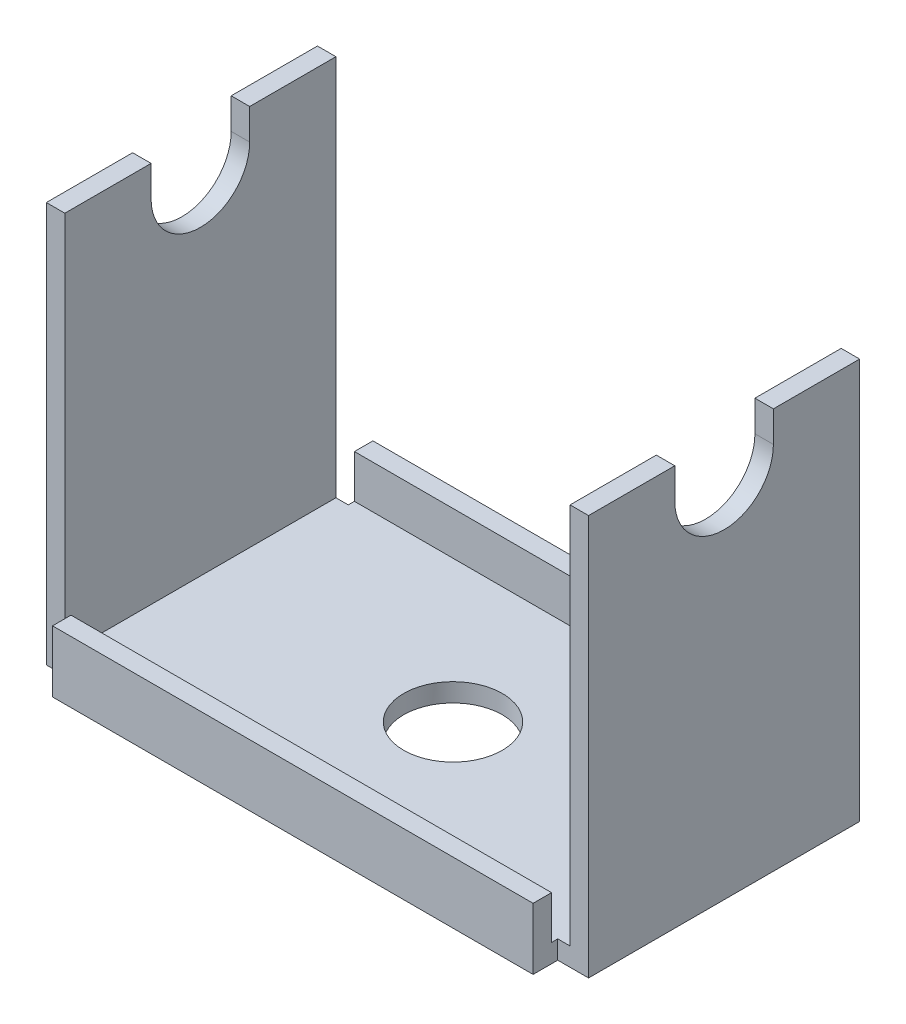
ISO-10303-21;
HEADER;
FILE_DESCRIPTION(('STEP AP214'),'2;1');
FILE_NAME('part.step','',(''),(''),'','','');
FILE_SCHEMA(('AUTOMOTIVE_DESIGN { 1 0 10303 214 1 1 1 1 }'));
ENDSEC;
DATA;
#1=APPLICATION_CONTEXT('core data for automotive mechanical design processes');
#2=APPLICATION_PROTOCOL_DEFINITION('international standard','automotive_design',2000,#1);
#3=PRODUCT_CONTEXT('',#1,'mechanical');
#4=PRODUCT('Part','Part','',(#3));
#5=PRODUCT_RELATED_PRODUCT_CATEGORY('part','',(#4));
#6=PRODUCT_DEFINITION_FORMATION('','',#4);
#7=PRODUCT_DEFINITION_CONTEXT('part definition',#1,'design');
#8=PRODUCT_DEFINITION('design','',#6,#7);
#9=PRODUCT_DEFINITION_SHAPE('','',#8);
#10=(LENGTH_UNIT() NAMED_UNIT(*) SI_UNIT(.MILLI.,.METRE.));
#11=(NAMED_UNIT(*) PLANE_ANGLE_UNIT() SI_UNIT($,.RADIAN.));
#12=(NAMED_UNIT(*) SI_UNIT($,.STERADIAN.) SOLID_ANGLE_UNIT());
#13=UNCERTAINTY_MEASURE_WITH_UNIT(LENGTH_MEASURE(1.E-05),#10,'distance_accuracy_value','');
#14=(GEOMETRIC_REPRESENTATION_CONTEXT(3) GLOBAL_UNCERTAINTY_ASSIGNED_CONTEXT((#13)) GLOBAL_UNIT_ASSIGNED_CONTEXT((#10,
#11,#12)) REPRESENTATION_CONTEXT('',''));
#15=CARTESIAN_POINT('',(0.,0.,0.));
#16=DIRECTION('',(0.,0.,1.));
#17=DIRECTION('',(1.,0.,0.));
#18=AXIS2_PLACEMENT_3D('',#15,#16,#17);
#19=CARTESIAN_POINT('',(-20.5,32.5,-11.));
#20=DIRECTION('',(0.,1.,0.));
#21=DIRECTION('',(0.,0.,1.));
#22=AXIS2_PLACEMENT_3D('',#19,#20,#21);
#23=PLANE('',#22);
#24=DIRECTION('',(1.,0.,0.));
#25=VECTOR('',#24,1.);
#26=CARTESIAN_POINT('',(-22.000025,32.5,4.));
#27=LINE('',#26,#25);
#28=CARTESIAN_POINT('',(-22.,32.5,4.));
#29=VERTEX_POINT('',#28);
#30=CARTESIAN_POINT('',(-20.5,32.5,4.));
#31=VERTEX_POINT('',#30);
#32=EDGE_CURVE('E512',#29,#31,#27,.T.);
#33=ORIENTED_EDGE('',*,*,#32,.F.);
#34=DIRECTION('',(0.,0.,1.));
#35=VECTOR('',#34,1.);
#36=CARTESIAN_POINT('',(-22.,32.5,-11.));
#37=LINE('',#36,#35);
#38=CARTESIAN_POINT('',(-22.,32.5,11.));
#39=VERTEX_POINT('',#38);
#40=EDGE_CURVE('E252',#29,#39,#37,.T.);
#41=ORIENTED_EDGE('',*,*,#40,.T.);
#42=DIRECTION('',(-1.,0.,0.));
#43=VECTOR('',#42,1.);
#44=CARTESIAN_POINT('',(-20.5,32.5,11.));
#45=LINE('',#44,#43);
#46=CARTESIAN_POINT('',(-20.5,32.5,11.));
#47=VERTEX_POINT('',#46);
#48=EDGE_CURVE('E266',#47,#39,#45,.T.);
#49=ORIENTED_EDGE('',*,*,#48,.F.);
#50=DIRECTION('',(0.,0.,1.));
#51=VECTOR('',#50,1.);
#52=CARTESIAN_POINT('',(-20.5,32.5,-11.));
#53=LINE('',#52,#51);
#54=EDGE_CURVE('E304',#31,#47,#53,.T.);
#55=ORIENTED_EDGE('',*,*,#54,.F.);
#56=EDGE_LOOP('',(#33,#41,#49,#55));
#57=FACE_BOUND('',#56,.T.);
#58=ADVANCED_FACE('F32',(#57),#23,.T.);
#59=CARTESIAN_POINT('',(22.,32.5,-11.));
#60=DIRECTION('',(0.,1.,0.));
#61=DIRECTION('',(0.,0.,1.));
#62=AXIS2_PLACEMENT_3D('',#59,#60,#61);
#63=PLANE('',#62);
#64=CARTESIAN_POINT('',(20.5,32.5,4.));
#65=VERTEX_POINT('',#64);
#66=CARTESIAN_POINT('',(22.,32.5,4.));
#67=VERTEX_POINT('',#66);
#68=EDGE_CURVE('E345',#65,#67,#27,.T.);
#69=ORIENTED_EDGE('',*,*,#68,.F.);
#70=DIRECTION('',(0.,0.,1.));
#71=VECTOR('',#70,1.);
#72=CARTESIAN_POINT('',(20.5,32.5,-11.));
#73=LINE('',#72,#71);
#74=CARTESIAN_POINT('',(20.5,32.5,11.));
#75=VERTEX_POINT('',#74);
#76=EDGE_CURVE('E296',#65,#75,#73,.T.);
#77=ORIENTED_EDGE('',*,*,#76,.T.);
#78=DIRECTION('',(-1.,0.,0.));
#79=VECTOR('',#78,1.);
#80=CARTESIAN_POINT('',(22.,32.5,11.));
#81=LINE('',#80,#79);
#82=CARTESIAN_POINT('',(22.,32.5,11.));
#83=VERTEX_POINT('',#82);
#84=EDGE_CURVE('E326',#83,#75,#81,.T.);
#85=ORIENTED_EDGE('',*,*,#84,.F.);
#86=DIRECTION('',(0.,0.,1.));
#87=VECTOR('',#86,1.);
#88=CARTESIAN_POINT('',(22.,32.5,-11.));
#89=LINE('',#88,#87);
#90=EDGE_CURVE('E292',#67,#83,#89,.T.);
#91=ORIENTED_EDGE('',*,*,#90,.F.);
#92=EDGE_LOOP('',(#69,#77,#85,#91));
#93=FACE_BOUND('',#92,.T.);
#94=ADVANCED_FACE('F343',(#93),#63,.T.);
#95=CARTESIAN_POINT('',(-22.,32.5,-11.));
#96=DIRECTION('',(0.,0.,1.));
#97=DIRECTION('',(1.,0.,0.));
#98=AXIS2_PLACEMENT_3D('',#95,#96,#97);
#99=PLANE('',#98);
#100=DIRECTION('',(0.,1.,0.));
#101=VECTOR('',#100,1.);
#102=CARTESIAN_POINT('',(-19.5,1.5,-11.));
#103=LINE('',#102,#101);
#104=CARTESIAN_POINT('',(-19.5,0.,-11.));
#105=VERTEX_POINT('',#104);
#106=CARTESIAN_POINT('',(-19.5,1.5,-11.));
#107=VERTEX_POINT('',#106);
#108=EDGE_CURVE('E439',#105,#107,#103,.T.);
#109=ORIENTED_EDGE('',*,*,#108,.F.);
#110=DIRECTION('',(1.,0.,0.));
#111=VECTOR('',#110,1.);
#112=CARTESIAN_POINT('',(-22.,0.,-11.));
#113=LINE('',#112,#111);
#114=CARTESIAN_POINT('',(-22.,0.,-11.));
#115=VERTEX_POINT('',#114);
#116=EDGE_CURVE('E420',#115,#105,#113,.T.);
#117=ORIENTED_EDGE('',*,*,#116,.F.);
#118=DIRECTION('',(0.,-1.,0.));
#119=VECTOR('',#118,1.);
#120=CARTESIAN_POINT('',(-22.,32.5,-11.));
#121=LINE('',#120,#119);
#122=CARTESIAN_POINT('',(-22.,32.5,-11.));
#123=VERTEX_POINT('',#122);
#124=EDGE_CURVE('E412',#123,#115,#121,.T.);
#125=ORIENTED_EDGE('',*,*,#124,.F.);
#126=DIRECTION('',(-1.,0.,0.));
#127=VECTOR('',#126,1.);
#128=CARTESIAN_POINT('',(-20.5,32.5,-11.));
#129=LINE('',#128,#127);
#130=CARTESIAN_POINT('',(-20.5,32.5,-11.));
#131=VERTEX_POINT('',#130);
#132=EDGE_CURVE('E312',#131,#123,#129,.T.);
#133=ORIENTED_EDGE('',*,*,#132,.F.);
#134=DIRECTION('',(0.,1.,0.));
#135=VECTOR('',#134,1.);
#136=CARTESIAN_POINT('',(-20.5,1.5,-11.));
#137=LINE('',#136,#135);
#138=CARTESIAN_POINT('',(-20.5,1.5,-11.));
#139=VERTEX_POINT('',#138);
#140=EDGE_CURVE('E248',#139,#131,#137,.T.);
#141=ORIENTED_EDGE('',*,*,#140,.F.);
#142=DIRECTION('',(-1.,0.,0.));
#143=VECTOR('',#142,1.);
#144=CARTESIAN_POINT('',(20.5,1.5,-11.));
#145=LINE('',#144,#143);
#146=EDGE_CURVE('E249',#107,#139,#145,.T.);
#147=ORIENTED_EDGE('',*,*,#146,.F.);
#148=EDGE_LOOP('',(#109,#117,#125,#133,#141,#147));
#149=FACE_BOUND('',#148,.T.);
#150=ADVANCED_FACE('F481',(#149),#99,.F.);
#151=CARTESIAN_POINT('',(-22.,32.5,11.));
#152=DIRECTION('',(0.,0.,1.));
#153=DIRECTION('',(1.,0.,0.));
#154=AXIS2_PLACEMENT_3D('',#151,#152,#153);
#155=PLANE('',#154);
#156=DIRECTION('',(1.,0.,0.));
#157=VECTOR('',#156,1.);
#158=CARTESIAN_POINT('',(-22.,0.,11.));
#159=LINE('',#158,#157);
#160=CARTESIAN_POINT('',(-22.,0.,11.));
#161=VERTEX_POINT('',#160);
#162=CARTESIAN_POINT('',(-19.5,0.,11.));
#163=VERTEX_POINT('',#162);
#164=EDGE_CURVE('E282',#161,#163,#159,.T.);
#165=ORIENTED_EDGE('',*,*,#164,.T.);
#166=DIRECTION('',(0.,1.,0.));
#167=VECTOR('',#166,1.);
#168=CARTESIAN_POINT('',(-19.5,1.5,11.));
#169=LINE('',#168,#167);
#170=CARTESIAN_POINT('',(-19.5,1.5,11.));
#171=VERTEX_POINT('',#170);
#172=EDGE_CURVE('E386',#163,#171,#169,.T.);
#173=ORIENTED_EDGE('',*,*,#172,.T.);
#174=DIRECTION('',(-1.,0.,0.));
#175=VECTOR('',#174,1.);
#176=CARTESIAN_POINT('',(20.5,1.5,11.));
#177=LINE('',#176,#175);
#178=CARTESIAN_POINT('',(-20.5,1.5,11.));
#179=VERTEX_POINT('',#178);
#180=EDGE_CURVE('E319',#171,#179,#177,.T.);
#181=ORIENTED_EDGE('',*,*,#180,.T.);
#182=DIRECTION('',(0.,1.,0.));
#183=VECTOR('',#182,1.);
#184=CARTESIAN_POINT('',(-20.5,1.5,11.));
#185=LINE('',#184,#183);
#186=EDGE_CURVE('E309',#179,#47,#185,.T.);
#187=ORIENTED_EDGE('',*,*,#186,.T.);
#188=ORIENTED_EDGE('',*,*,#48,.T.);
#189=DIRECTION('',(0.,-1.,0.));
#190=VECTOR('',#189,1.);
#191=CARTESIAN_POINT('',(-22.,32.5,11.));
#192=LINE('',#191,#190);
#193=EDGE_CURVE('E269',#39,#161,#192,.T.);
#194=ORIENTED_EDGE('',*,*,#193,.T.);
#195=EDGE_LOOP('',(#165,#173,#181,#187,#188,#194));
#196=FACE_BOUND('',#195,.T.);
#197=ADVANCED_FACE('F499',(#196),#155,.T.);
#198=DIRECTION('',(1.,0.,0.));
#199=VECTOR('',#198,1.);
#200=CARTESIAN_POINT('',(-22.000025,32.5,-4.));
#201=LINE('',#200,#199);
#202=CARTESIAN_POINT('',(-22.,32.5,-4.));
#203=VERTEX_POINT('',#202);
#204=CARTESIAN_POINT('',(-20.5,32.5,-4.));
#205=VERTEX_POINT('',#204);
#206=EDGE_CURVE('E508',#203,#205,#201,.T.);
#207=ORIENTED_EDGE('',*,*,#206,.T.);
#208=EDGE_CURVE('E305',#131,#205,#53,.T.);
#209=ORIENTED_EDGE('',*,*,#208,.F.);
#210=ORIENTED_EDGE('',*,*,#132,.T.);
#211=EDGE_CURVE('E284',#123,#203,#37,.T.);
#212=ORIENTED_EDGE('',*,*,#211,.T.);
#213=EDGE_LOOP('',(#207,#209,#210,#212));
#214=FACE_BOUND('',#213,.T.);
#215=ADVANCED_FACE('F34',(#214),#23,.T.);
#216=CARTESIAN_POINT('',(-20.5,1.5,-11.));
#217=DIRECTION('',(1.,0.,0.));
#218=DIRECTION('',(0.,0.,-1.));
#219=AXIS2_PLACEMENT_3D('',#216,#217,#218);
#220=PLANE('',#219);
#221=DIRECTION('',(0.,-1.,0.));
#222=VECTOR('',#221,1.);
#223=CARTESIAN_POINT('',(-20.5,1.5,4.));
#224=LINE('',#223,#222);
#225=CARTESIAN_POINT('',(-20.5,30.,4.));
#226=VERTEX_POINT('',#225);
#227=EDGE_CURVE('E526',#31,#226,#224,.T.);
#228=ORIENTED_EDGE('',*,*,#227,.F.);
#229=ORIENTED_EDGE('',*,*,#54,.T.);
#230=ORIENTED_EDGE('',*,*,#186,.F.);
#231=DIRECTION('',(0.,0.,1.));
#232=VECTOR('',#231,1.);
#233=CARTESIAN_POINT('',(-20.5,1.5,-11.));
#234=LINE('',#233,#232);
#235=EDGE_CURVE('E301',#139,#179,#234,.T.);
#236=ORIENTED_EDGE('',*,*,#235,.F.);
#237=ORIENTED_EDGE('',*,*,#140,.T.);
#238=ORIENTED_EDGE('',*,*,#208,.T.);
#239=DIRECTION('',(0.,1.,0.));
#240=VECTOR('',#239,1.);
#241=CARTESIAN_POINT('',(-20.5,1.5,-4.));
#242=LINE('',#241,#240);
#243=CARTESIAN_POINT('',(-20.5,30.,-4.));
#244=VERTEX_POINT('',#243);
#245=EDGE_CURVE('E521',#244,#205,#242,.T.);
#246=ORIENTED_EDGE('',*,*,#245,.F.);
#247=CARTESIAN_POINT('',(-20.5,30.,0.));
#248=DIRECTION('',(1.,0.,0.));
#249=DIRECTION('',(0.,0.,-1.));
#250=AXIS2_PLACEMENT_3D('',#247,#248,#249);
#251=CIRCLE('',#250,4.);
#252=EDGE_CURVE('E530',#226,#244,#251,.T.);
#253=ORIENTED_EDGE('',*,*,#252,.F.);
#254=EDGE_LOOP('',(#228,#229,#230,#236,#237,#238,#246,#253));
#255=FACE_BOUND('',#254,.T.);
#256=ADVANCED_FACE('F486',(#255),#220,.T.);
#257=CARTESIAN_POINT('',(20.5,1.5,-11.));
#258=DIRECTION('',(0.,1.,0.));
#259=DIRECTION('',(0.,0.,1.));
#260=AXIS2_PLACEMENT_3D('',#257,#258,#259);
#261=PLANE('',#260);
#262=CARTESIAN_POINT('',(0.,1.5,0.));
#263=DIRECTION('',(0.,1.,0.));
#264=DIRECTION('',(0.,0.,1.));
#265=AXIS2_PLACEMENT_3D('',#262,#263,#264);
#266=CIRCLE('',#265,4.);
#267=CARTESIAN_POINT('',(0.,1.5,4.));
#268=VERTEX_POINT('',#267);
#269=EDGE_CURVE('E532',#268,#268,#266,.T.);
#270=ORIENTED_EDGE('',*,*,#269,.F.);
#271=EDGE_LOOP('',(#270));
#272=FACE_BOUND('',#271,.T.);
#273=CARTESIAN_POINT('',(20.5,1.5,11.));
#274=VERTEX_POINT('',#273);
#275=CARTESIAN_POINT('',(19.5,1.5,11.));
#276=VERTEX_POINT('',#275);
#277=EDGE_CURVE('E313',#274,#276,#177,.T.);
#278=ORIENTED_EDGE('',*,*,#277,.F.);
#279=DIRECTION('',(0.,0.,1.));
#280=VECTOR('',#279,1.);
#281=CARTESIAN_POINT('',(20.5,1.5,-11.));
#282=LINE('',#281,#280);
#283=CARTESIAN_POINT('',(20.5,1.5,-11.));
#284=VERTEX_POINT('',#283);
#285=EDGE_CURVE('E247',#284,#274,#282,.T.);
#286=ORIENTED_EDGE('',*,*,#285,.F.);
#287=CARTESIAN_POINT('',(19.5,1.5,-11.));
#288=VERTEX_POINT('',#287);
#289=EDGE_CURVE('E238',#284,#288,#145,.T.);
#290=ORIENTED_EDGE('',*,*,#289,.T.);
#291=DIRECTION('',(0.,0.,-1.));
#292=VECTOR('',#291,1.);
#293=CARTESIAN_POINT('',(19.5,1.5,-11.5));
#294=LINE('',#293,#292);
#295=CARTESIAN_POINT('',(19.5,1.5,-11.5));
#296=VERTEX_POINT('',#295);
#297=EDGE_CURVE('E220',#288,#296,#294,.T.);
#298=ORIENTED_EDGE('',*,*,#297,.T.);
#299=DIRECTION('',(-1.,0.,0.));
#300=VECTOR('',#299,1.);
#301=CARTESIAN_POINT('',(19.5,1.5,-11.5));
#302=LINE('',#301,#300);
#303=CARTESIAN_POINT('',(-19.5,1.5,-11.5));
#304=VERTEX_POINT('',#303);
#305=EDGE_CURVE('E231',#296,#304,#302,.T.);
#306=ORIENTED_EDGE('',*,*,#305,.T.);
#307=DIRECTION('',(0.,0.,-1.));
#308=VECTOR('',#307,1.);
#309=CARTESIAN_POINT('',(-19.5,1.5,-11.5));
#310=LINE('',#309,#308);
#311=EDGE_CURVE('E243',#107,#304,#310,.T.);
#312=ORIENTED_EDGE('',*,*,#311,.F.);
#313=ORIENTED_EDGE('',*,*,#146,.T.);
#314=ORIENTED_EDGE('',*,*,#235,.T.);
#315=ORIENTED_EDGE('',*,*,#180,.F.);
#316=DIRECTION('',(0.,0.,1.));
#317=VECTOR('',#316,1.);
#318=CARTESIAN_POINT('',(-19.5,1.5,11.5));
#319=LINE('',#318,#317);
#320=CARTESIAN_POINT('',(-19.5,1.5,11.5));
#321=VERTEX_POINT('',#320);
#322=EDGE_CURVE('E388',#171,#321,#319,.T.);
#323=ORIENTED_EDGE('',*,*,#322,.T.);
#324=DIRECTION('',(-1.,0.,0.));
#325=VECTOR('',#324,1.);
#326=CARTESIAN_POINT('',(19.5,1.5,11.5));
#327=LINE('',#326,#325);
#328=CARTESIAN_POINT('',(19.5,1.5,11.5));
#329=VERTEX_POINT('',#328);
#330=EDGE_CURVE('E270',#329,#321,#327,.T.);
#331=ORIENTED_EDGE('',*,*,#330,.F.);
#332=DIRECTION('',(0.,0.,1.));
#333=VECTOR('',#332,1.);
#334=CARTESIAN_POINT('',(19.5,1.5,11.5));
#335=LINE('',#334,#333);
#336=EDGE_CURVE('E350',#276,#329,#335,.T.);
#337=ORIENTED_EDGE('',*,*,#336,.F.);
#338=EDGE_LOOP('',(#278,#286,#290,#298,#306,#312,#313,#314,#315,#323,#331,#337));
#339=FACE_BOUND('',#338,.T.);
#340=ADVANCED_FACE('F246',(#272,#339),#261,.T.);
#341=CARTESIAN_POINT('',(20.5,32.5,-11.));
#342=DIRECTION('',(-1.,0.,0.));
#343=DIRECTION('',(0.,0.,1.));
#344=AXIS2_PLACEMENT_3D('',#341,#342,#343);
#345=PLANE('',#344);
#346=DIRECTION('',(0.,1.,0.));
#347=VECTOR('',#346,1.);
#348=CARTESIAN_POINT('',(20.5,32.5,4.));
#349=LINE('',#348,#347);
#350=CARTESIAN_POINT('',(20.5,30.,4.));
#351=VERTEX_POINT('',#350);
#352=EDGE_CURVE('E524',#351,#65,#349,.T.);
#353=ORIENTED_EDGE('',*,*,#352,.F.);
#354=CARTESIAN_POINT('',(20.5,30.,0.));
#355=DIRECTION('',(-1.,0.,0.));
#356=DIRECTION('',(0.,0.,1.));
#357=AXIS2_PLACEMENT_3D('',#354,#355,#356);
#358=CIRCLE('',#357,4.);
#359=CARTESIAN_POINT('',(20.5,30.,-4.));
#360=VERTEX_POINT('',#359);
#361=EDGE_CURVE('E528',#360,#351,#358,.T.);
#362=ORIENTED_EDGE('',*,*,#361,.F.);
#363=DIRECTION('',(0.,-1.,0.));
#364=VECTOR('',#363,1.);
#365=CARTESIAN_POINT('',(20.5,32.5,-4.));
#366=LINE('',#365,#364);
#367=CARTESIAN_POINT('',(20.5,32.5,-4.));
#368=VERTEX_POINT('',#367);
#369=EDGE_CURVE('E519',#368,#360,#366,.T.);
#370=ORIENTED_EDGE('',*,*,#369,.F.);
#371=CARTESIAN_POINT('',(20.5,32.5,-11.));
#372=VERTEX_POINT('',#371);
#373=EDGE_CURVE('E297',#372,#368,#73,.T.);
#374=ORIENTED_EDGE('',*,*,#373,.F.);
#375=DIRECTION('',(0.,-1.,0.));
#376=VECTOR('',#375,1.);
#377=CARTESIAN_POINT('',(20.5,32.5,-11.));
#378=LINE('',#377,#376);
#379=EDGE_CURVE('E254',#372,#284,#378,.T.);
#380=ORIENTED_EDGE('',*,*,#379,.T.);
#381=ORIENTED_EDGE('',*,*,#285,.T.);
#382=DIRECTION('',(0.,-1.,0.));
#383=VECTOR('',#382,1.);
#384=CARTESIAN_POINT('',(20.5,32.5,11.));
#385=LINE('',#384,#383);
#386=EDGE_CURVE('E316',#75,#274,#385,.T.);
#387=ORIENTED_EDGE('',*,*,#386,.F.);
#388=ORIENTED_EDGE('',*,*,#76,.F.);
#389=EDGE_LOOP('',(#353,#362,#370,#374,#380,#381,#387,#388));
#390=FACE_BOUND('',#389,.T.);
#391=ADVANCED_FACE('F348',(#390),#345,.T.);
#392=CARTESIAN_POINT('',(22.,32.5,-4.));
#393=VERTEX_POINT('',#392);
#394=EDGE_CURVE('E510',#368,#393,#201,.T.);
#395=ORIENTED_EDGE('',*,*,#394,.T.);
#396=CARTESIAN_POINT('',(22.,32.5,-11.));
#397=VERTEX_POINT('',#396);
#398=EDGE_CURVE('E293',#397,#393,#89,.T.);
#399=ORIENTED_EDGE('',*,*,#398,.F.);
#400=DIRECTION('',(-1.,0.,0.));
#401=VECTOR('',#400,1.);
#402=CARTESIAN_POINT('',(22.,32.5,-11.));
#403=LINE('',#402,#401);
#404=EDGE_CURVE('E425',#397,#372,#403,.T.);
#405=ORIENTED_EDGE('',*,*,#404,.T.);
#406=ORIENTED_EDGE('',*,*,#373,.T.);
#407=EDGE_LOOP('',(#395,#399,#405,#406));
#408=FACE_BOUND('',#407,.T.);
#409=ADVANCED_FACE('F563',(#408),#63,.T.);
#410=CARTESIAN_POINT('',(22.,0.,-11.));
#411=DIRECTION('',(1.,0.,0.));
#412=DIRECTION('',(0.,1.,0.));
#413=AXIS2_PLACEMENT_3D('',#410,#411,#412);
#414=PLANE('',#413);
#415=DIRECTION('',(0.,-1.,0.));
#416=VECTOR('',#415,1.);
#417=CARTESIAN_POINT('',(22.,30.,4.));
#418=LINE('',#417,#416);
#419=CARTESIAN_POINT('',(22.,30.,4.));
#420=VERTEX_POINT('',#419);
#421=EDGE_CURVE('E340',#67,#420,#418,.T.);
#422=ORIENTED_EDGE('',*,*,#421,.F.);
#423=ORIENTED_EDGE('',*,*,#90,.T.);
#424=DIRECTION('',(0.,1.,0.));
#425=VECTOR('',#424,1.);
#426=CARTESIAN_POINT('',(22.,0.,11.));
#427=LINE('',#426,#425);
#428=CARTESIAN_POINT('',(22.,0.,11.));
#429=VERTEX_POINT('',#428);
#430=EDGE_CURVE('E276',#429,#83,#427,.T.);
#431=ORIENTED_EDGE('',*,*,#430,.F.);
#432=DIRECTION('',(0.,0.,1.));
#433=VECTOR('',#432,1.);
#434=CARTESIAN_POINT('',(22.,0.,-11.));
#435=LINE('',#434,#433);
#436=CARTESIAN_POINT('',(22.,0.,-11.));
#437=VERTEX_POINT('',#436);
#438=EDGE_CURVE('E289',#437,#429,#435,.T.);
#439=ORIENTED_EDGE('',*,*,#438,.F.);
#440=DIRECTION('',(0.,1.,0.));
#441=VECTOR('',#440,1.);
#442=CARTESIAN_POINT('',(22.,0.,-11.));
#443=LINE('',#442,#441);
#444=EDGE_CURVE('E417',#437,#397,#443,.T.);
#445=ORIENTED_EDGE('',*,*,#444,.T.);
#446=ORIENTED_EDGE('',*,*,#398,.T.);
#447=DIRECTION('',(0.,1.,0.));
#448=VECTOR('',#447,1.);
#449=CARTESIAN_POINT('',(22.,32.5,-4.));
#450=LINE('',#449,#448);
#451=CARTESIAN_POINT('',(22.,30.,-4.));
#452=VERTEX_POINT('',#451);
#453=EDGE_CURVE('E555',#452,#393,#450,.T.);
#454=ORIENTED_EDGE('',*,*,#453,.F.);
#455=CARTESIAN_POINT('',(22.,30.,0.));
#456=DIRECTION('',(1.,0.,0.));
#457=DIRECTION('',(0.,1.,0.));
#458=AXIS2_PLACEMENT_3D('',#455,#456,#457);
#459=CIRCLE('',#458,4.);
#460=EDGE_CURVE('E49',#420,#452,#459,.T.);
#461=ORIENTED_EDGE('',*,*,#460,.F.);
#462=EDGE_LOOP('',(#422,#423,#431,#439,#445,#446,#454,#461));
#463=FACE_BOUND('',#462,.T.);
#464=ADVANCED_FACE('F337',(#463),#414,.T.);
#465=CARTESIAN_POINT('',(-22.,0.,-11.));
#466=DIRECTION('',(0.,-1.,0.));
#467=DIRECTION('',(0.,0.,-1.));
#468=AXIS2_PLACEMENT_3D('',#465,#466,#467);
#469=PLANE('',#468);
#470=CARTESIAN_POINT('',(0.,0.,0.));
#471=DIRECTION('',(0.,-1.,0.));
#472=DIRECTION('',(0.,0.,-1.));
#473=AXIS2_PLACEMENT_3D('',#470,#471,#472);
#474=CIRCLE('',#473,4.);
#475=CARTESIAN_POINT('',(0.,0.,-4.));
#476=VERTEX_POINT('',#475);
#477=EDGE_CURVE('E443',#476,#476,#474,.T.);
#478=ORIENTED_EDGE('',*,*,#477,.F.);
#479=EDGE_LOOP('',(#478));
#480=FACE_BOUND('',#479,.T.);
#481=ORIENTED_EDGE('',*,*,#164,.F.);
#482=DIRECTION('',(0.,0.,1.));
#483=VECTOR('',#482,1.);
#484=CARTESIAN_POINT('',(-22.,0.,-11.));
#485=LINE('',#484,#483);
#486=EDGE_CURVE('E287',#115,#161,#485,.T.);
#487=ORIENTED_EDGE('',*,*,#486,.F.);
#488=ORIENTED_EDGE('',*,*,#116,.T.);
#489=DIRECTION('',(0.,0.,1.));
#490=VECTOR('',#489,1.);
#491=CARTESIAN_POINT('',(-19.5,0.,-11.));
#492=LINE('',#491,#490);
#493=CARTESIAN_POINT('',(-19.5,0.,-13.));
#494=VERTEX_POINT('',#493);
#495=EDGE_CURVE('E442',#494,#105,#492,.T.);
#496=ORIENTED_EDGE('',*,*,#495,.F.);
#497=DIRECTION('',(-1.,0.,0.));
#498=VECTOR('',#497,1.);
#499=CARTESIAN_POINT('',(19.5,0.,-13.));
#500=LINE('',#499,#498);
#501=CARTESIAN_POINT('',(19.5,0.,-13.));
#502=VERTEX_POINT('',#501);
#503=EDGE_CURVE('E374',#502,#494,#500,.T.);
#504=ORIENTED_EDGE('',*,*,#503,.F.);
#505=DIRECTION('',(0.,0.,1.));
#506=VECTOR('',#505,1.);
#507=CARTESIAN_POINT('',(19.5,0.,-11.));
#508=LINE('',#507,#506);
#509=CARTESIAN_POINT('',(19.5,0.,-11.));
#510=VERTEX_POINT('',#509);
#511=EDGE_CURVE('E242',#502,#510,#508,.T.);
#512=ORIENTED_EDGE('',*,*,#511,.T.);
#513=EDGE_CURVE('E241',#510,#437,#113,.T.);
#514=ORIENTED_EDGE('',*,*,#513,.T.);
#515=ORIENTED_EDGE('',*,*,#438,.T.);
#516=CARTESIAN_POINT('',(19.5,0.,11.));
#517=VERTEX_POINT('',#516);
#518=EDGE_CURVE('E273',#517,#429,#159,.T.);
#519=ORIENTED_EDGE('',*,*,#518,.F.);
#520=DIRECTION('',(0.,0.,-1.));
#521=VECTOR('',#520,1.);
#522=CARTESIAN_POINT('',(19.5,0.,11.));
#523=LINE('',#522,#521);
#524=CARTESIAN_POINT('',(19.5,0.,13.));
#525=VERTEX_POINT('',#524);
#526=EDGE_CURVE('E360',#525,#517,#523,.T.);
#527=ORIENTED_EDGE('',*,*,#526,.F.);
#528=DIRECTION('',(-1.,0.,0.));
#529=VECTOR('',#528,1.);
#530=CARTESIAN_POINT('',(19.5,0.,13.));
#531=LINE('',#530,#529);
#532=CARTESIAN_POINT('',(-19.5,0.,13.));
#533=VERTEX_POINT('',#532);
#534=EDGE_CURVE('E402',#525,#533,#531,.T.);
#535=ORIENTED_EDGE('',*,*,#534,.T.);
#536=DIRECTION('',(0.,0.,-1.));
#537=VECTOR('',#536,1.);
#538=CARTESIAN_POINT('',(-19.5,0.,11.));
#539=LINE('',#538,#537);
#540=EDGE_CURVE('E361',#533,#163,#539,.T.);
#541=ORIENTED_EDGE('',*,*,#540,.T.);
#542=EDGE_LOOP('',(#481,#487,#488,#496,#504,#512,#514,#515,#519,#527,#535,#541));
#543=FACE_BOUND('',#542,.T.);
#544=ADVANCED_FACE('F427',(#480,#543),#469,.T.);
#545=CARTESIAN_POINT('',(-22.,32.5,-11.));
#546=DIRECTION('',(-1.,0.,0.));
#547=DIRECTION('',(0.,-1.,0.));
#548=AXIS2_PLACEMENT_3D('',#545,#546,#547);
#549=PLANE('',#548);
#550=DIRECTION('',(0.,1.,0.));
#551=VECTOR('',#550,1.);
#552=CARTESIAN_POINT('',(-22.,32.5,4.));
#553=LINE('',#552,#551);
#554=CARTESIAN_POINT('',(-22.,30.,4.));
#555=VERTEX_POINT('',#554);
#556=EDGE_CURVE('E11',#555,#29,#553,.T.);
#557=ORIENTED_EDGE('',*,*,#556,.F.);
#558=CARTESIAN_POINT('',(-22.,30.,0.));
#559=DIRECTION('',(1.,0.,0.));
#560=DIRECTION('',(0.,1.,0.));
#561=AXIS2_PLACEMENT_3D('',#558,#559,#560);
#562=CIRCLE('',#561,4.);
#563=CARTESIAN_POINT('',(-22.,30.,-4.));
#564=VERTEX_POINT('',#563);
#565=EDGE_CURVE('E36',#564,#555,#562,.F.);
#566=ORIENTED_EDGE('',*,*,#565,.F.);
#567=DIRECTION('',(0.,-1.,0.));
#568=VECTOR('',#567,1.);
#569=CARTESIAN_POINT('',(-22.,32.5,-4.));
#570=LINE('',#569,#568);
#571=EDGE_CURVE('E308',#203,#564,#570,.T.);
#572=ORIENTED_EDGE('',*,*,#571,.F.);
#573=ORIENTED_EDGE('',*,*,#211,.F.);
#574=ORIENTED_EDGE('',*,*,#124,.T.);
#575=ORIENTED_EDGE('',*,*,#486,.T.);
#576=ORIENTED_EDGE('',*,*,#193,.F.);
#577=ORIENTED_EDGE('',*,*,#40,.F.);
#578=EDGE_LOOP('',(#557,#566,#572,#573,#574,#575,#576,#577));
#579=FACE_BOUND('',#578,.T.);
#580=ADVANCED_FACE('F504',(#579),#549,.T.);
#581=ORIENTED_EDGE('',*,*,#513,.F.);
#582=DIRECTION('',(0.,1.,0.));
#583=VECTOR('',#582,1.);
#584=CARTESIAN_POINT('',(19.5,1.5,-11.));
#585=LINE('',#584,#583);
#586=EDGE_CURVE('E224',#510,#288,#585,.T.);
#587=ORIENTED_EDGE('',*,*,#586,.T.);
#588=ORIENTED_EDGE('',*,*,#289,.F.);
#589=ORIENTED_EDGE('',*,*,#379,.F.);
#590=ORIENTED_EDGE('',*,*,#404,.F.);
#591=ORIENTED_EDGE('',*,*,#444,.F.);
#592=EDGE_LOOP('',(#581,#587,#588,#589,#590,#591));
#593=FACE_BOUND('',#592,.T.);
#594=ADVANCED_FACE('F236',(#593),#99,.F.);
#595=DIRECTION('',(0.,1.,0.));
#596=VECTOR('',#595,1.);
#597=CARTESIAN_POINT('',(19.5,1.5,11.));
#598=LINE('',#597,#596);
#599=EDGE_CURVE('E356',#517,#276,#598,.T.);
#600=ORIENTED_EDGE('',*,*,#599,.F.);
#601=ORIENTED_EDGE('',*,*,#518,.T.);
#602=ORIENTED_EDGE('',*,*,#430,.T.);
#603=ORIENTED_EDGE('',*,*,#84,.T.);
#604=ORIENTED_EDGE('',*,*,#386,.T.);
#605=ORIENTED_EDGE('',*,*,#277,.T.);
#606=EDGE_LOOP('',(#600,#601,#602,#603,#604,#605));
#607=FACE_BOUND('',#606,.T.);
#608=ADVANCED_FACE('F332',(#607),#155,.T.);
#609=CARTESIAN_POINT('',(19.5,5.,11.5));
#610=DIRECTION('',(0.,0.,1.));
#611=DIRECTION('',(1.,0.,0.));
#612=AXIS2_PLACEMENT_3D('',#609,#610,#611);
#613=PLANE('',#612);
#614=DIRECTION('',(0.,1.,0.));
#615=VECTOR('',#614,1.);
#616=CARTESIAN_POINT('',(-19.5,5.,11.5));
#617=LINE('',#616,#615);
#618=CARTESIAN_POINT('',(-19.5,5.,11.5));
#619=VERTEX_POINT('',#618);
#620=EDGE_CURVE('E383',#321,#619,#617,.T.);
#621=ORIENTED_EDGE('',*,*,#620,.T.);
#622=DIRECTION('',(-1.,0.,0.));
#623=VECTOR('',#622,1.);
#624=CARTESIAN_POINT('',(19.5,5.,11.5));
#625=LINE('',#624,#623);
#626=CARTESIAN_POINT('',(19.5,5.,11.5));
#627=VERTEX_POINT('',#626);
#628=EDGE_CURVE('E407',#627,#619,#625,.T.);
#629=ORIENTED_EDGE('',*,*,#628,.F.);
#630=DIRECTION('',(0.,1.,0.));
#631=VECTOR('',#630,1.);
#632=CARTESIAN_POINT('',(19.5,5.,11.5));
#633=LINE('',#632,#631);
#634=EDGE_CURVE('E355',#329,#627,#633,.T.);
#635=ORIENTED_EDGE('',*,*,#634,.F.);
#636=ORIENTED_EDGE('',*,*,#330,.T.);
#637=EDGE_LOOP('',(#621,#629,#635,#636));
#638=FACE_BOUND('',#637,.T.);
#639=ADVANCED_FACE('F597',(#638),#613,.F.);
#640=CARTESIAN_POINT('',(19.5,5.,13.));
#641=DIRECTION('',(0.,-1.,0.));
#642=DIRECTION('',(0.,0.,-1.));
#643=AXIS2_PLACEMENT_3D('',#640,#641,#642);
#644=PLANE('',#643);
#645=DIRECTION('',(0.,0.,1.));
#646=VECTOR('',#645,1.);
#647=CARTESIAN_POINT('',(-19.5,5.,13.));
#648=LINE('',#647,#646);
#649=CARTESIAN_POINT('',(-19.5,5.,13.));
#650=VERTEX_POINT('',#649);
#651=EDGE_CURVE('E391',#619,#650,#648,.T.);
#652=ORIENTED_EDGE('',*,*,#651,.T.);
#653=DIRECTION('',(-1.,0.,0.));
#654=VECTOR('',#653,1.);
#655=CARTESIAN_POINT('',(19.5,5.,13.));
#656=LINE('',#655,#654);
#657=CARTESIAN_POINT('',(19.5,5.,13.));
#658=VERTEX_POINT('',#657);
#659=EDGE_CURVE('E405',#658,#650,#656,.T.);
#660=ORIENTED_EDGE('',*,*,#659,.F.);
#661=DIRECTION('',(0.,0.,1.));
#662=VECTOR('',#661,1.);
#663=CARTESIAN_POINT('',(19.5,5.,13.));
#664=LINE('',#663,#662);
#665=EDGE_CURVE('E377',#627,#658,#664,.T.);
#666=ORIENTED_EDGE('',*,*,#665,.F.);
#667=ORIENTED_EDGE('',*,*,#628,.T.);
#668=EDGE_LOOP('',(#652,#660,#666,#667));
#669=FACE_BOUND('',#668,.T.);
#670=ADVANCED_FACE('F602',(#669),#644,.F.);
#671=CARTESIAN_POINT('',(19.5,0.,13.));
#672=DIRECTION('',(0.,0.,-1.));
#673=DIRECTION('',(-1.,0.,0.));
#674=AXIS2_PLACEMENT_3D('',#671,#672,#673);
#675=PLANE('',#674);
#676=DIRECTION('',(0.,-1.,0.));
#677=VECTOR('',#676,1.);
#678=CARTESIAN_POINT('',(-19.5,0.,13.));
#679=LINE('',#678,#677);
#680=EDGE_CURVE('E364',#650,#533,#679,.T.);
#681=ORIENTED_EDGE('',*,*,#680,.T.);
#682=ORIENTED_EDGE('',*,*,#534,.F.);
#683=DIRECTION('',(0.,-1.,0.));
#684=VECTOR('',#683,1.);
#685=CARTESIAN_POINT('',(19.5,0.,13.));
#686=LINE('',#685,#684);
#687=EDGE_CURVE('E379',#658,#525,#686,.T.);
#688=ORIENTED_EDGE('',*,*,#687,.F.);
#689=ORIENTED_EDGE('',*,*,#659,.T.);
#690=EDGE_LOOP('',(#681,#682,#688,#689));
#691=FACE_BOUND('',#690,.T.);
#692=ADVANCED_FACE('F496',(#691),#675,.F.);
#693=CARTESIAN_POINT('',(19.5,0.,11.));
#694=DIRECTION('',(-1.,0.,0.));
#695=DIRECTION('',(0.,0.,1.));
#696=AXIS2_PLACEMENT_3D('',#693,#694,#695);
#697=PLANE('',#696);
#698=ORIENTED_EDGE('',*,*,#599,.T.);
#699=ORIENTED_EDGE('',*,*,#336,.T.);
#700=ORIENTED_EDGE('',*,*,#634,.T.);
#701=ORIENTED_EDGE('',*,*,#665,.T.);
#702=ORIENTED_EDGE('',*,*,#687,.T.);
#703=ORIENTED_EDGE('',*,*,#526,.T.);
#704=EDGE_LOOP('',(#698,#699,#700,#701,#702,#703));
#705=FACE_BOUND('',#704,.T.);
#706=ADVANCED_FACE('F358',(#705),#697,.F.);
#707=CARTESIAN_POINT('',(-19.5,0.,11.));
#708=DIRECTION('',(-1.,0.,0.));
#709=DIRECTION('',(0.,0.,1.));
#710=AXIS2_PLACEMENT_3D('',#707,#708,#709);
#711=PLANE('',#710);
#712=ORIENTED_EDGE('',*,*,#172,.F.);
#713=ORIENTED_EDGE('',*,*,#540,.F.);
#714=ORIENTED_EDGE('',*,*,#680,.F.);
#715=ORIENTED_EDGE('',*,*,#651,.F.);
#716=ORIENTED_EDGE('',*,*,#620,.F.);
#717=ORIENTED_EDGE('',*,*,#322,.F.);
#718=EDGE_LOOP('',(#712,#713,#714,#715,#716,#717));
#719=FACE_BOUND('',#718,.T.);
#720=ADVANCED_FACE('F491',(#719),#711,.T.);
#721=CARTESIAN_POINT('',(19.5,0.,-13.));
#722=DIRECTION('',(0.,0.,-1.));
#723=DIRECTION('',(-1.,0.,0.));
#724=AXIS2_PLACEMENT_3D('',#721,#722,#723);
#725=PLANE('',#724);
#726=DIRECTION('',(0.,-1.,0.));
#727=VECTOR('',#726,1.);
#728=CARTESIAN_POINT('',(-19.5,0.,-13.));
#729=LINE('',#728,#727);
#730=CARTESIAN_POINT('',(-19.5,5.,-13.));
#731=VERTEX_POINT('',#730);
#732=EDGE_CURVE('E449',#731,#494,#729,.T.);
#733=ORIENTED_EDGE('',*,*,#732,.F.);
#734=DIRECTION('',(-1.,0.,0.));
#735=VECTOR('',#734,1.);
#736=CARTESIAN_POINT('',(19.5,5.,-13.));
#737=LINE('',#736,#735);
#738=CARTESIAN_POINT('',(19.5,5.,-13.));
#739=VERTEX_POINT('',#738);
#740=EDGE_CURVE('E460',#739,#731,#737,.T.);
#741=ORIENTED_EDGE('',*,*,#740,.F.);
#742=DIRECTION('',(0.,-1.,0.));
#743=VECTOR('',#742,1.);
#744=CARTESIAN_POINT('',(19.5,0.,-13.));
#745=LINE('',#744,#743);
#746=EDGE_CURVE('E430',#739,#502,#745,.T.);
#747=ORIENTED_EDGE('',*,*,#746,.T.);
#748=ORIENTED_EDGE('',*,*,#503,.T.);
#749=EDGE_LOOP('',(#733,#741,#747,#748));
#750=FACE_BOUND('',#749,.T.);
#751=ADVANCED_FACE('F466',(#750),#725,.T.);
#752=CARTESIAN_POINT('',(19.5,5.,-13.));
#753=DIRECTION('',(0.,1.,0.));
#754=DIRECTION('',(0.,0.,1.));
#755=AXIS2_PLACEMENT_3D('',#752,#753,#754);
#756=PLANE('',#755);
#757=DIRECTION('',(0.,0.,-1.));
#758=VECTOR('',#757,1.);
#759=CARTESIAN_POINT('',(-19.5,5.,-13.));
#760=LINE('',#759,#758);
#761=CARTESIAN_POINT('',(-19.5,5.,-11.5));
#762=VERTEX_POINT('',#761);
#763=EDGE_CURVE('E452',#762,#731,#760,.T.);
#764=ORIENTED_EDGE('',*,*,#763,.F.);
#765=DIRECTION('',(-1.,0.,0.));
#766=VECTOR('',#765,1.);
#767=CARTESIAN_POINT('',(19.5,5.,-11.5));
#768=LINE('',#767,#766);
#769=CARTESIAN_POINT('',(19.5,5.,-11.5));
#770=VERTEX_POINT('',#769);
#771=EDGE_CURVE('E459',#770,#762,#768,.T.);
#772=ORIENTED_EDGE('',*,*,#771,.F.);
#773=DIRECTION('',(0.,0.,-1.));
#774=VECTOR('',#773,1.);
#775=CARTESIAN_POINT('',(19.5,5.,-13.));
#776=LINE('',#775,#774);
#777=EDGE_CURVE('E432',#770,#739,#776,.T.);
#778=ORIENTED_EDGE('',*,*,#777,.T.);
#779=ORIENTED_EDGE('',*,*,#740,.T.);
#780=EDGE_LOOP('',(#764,#772,#778,#779));
#781=FACE_BOUND('',#780,.T.);
#782=ADVANCED_FACE('F472',(#781),#756,.T.);
#783=CARTESIAN_POINT('',(19.5,5.,-11.5));
#784=DIRECTION('',(0.,0.,1.));
#785=DIRECTION('',(1.,0.,0.));
#786=AXIS2_PLACEMENT_3D('',#783,#784,#785);
#787=PLANE('',#786);
#788=DIRECTION('',(0.,1.,0.));
#789=VECTOR('',#788,1.);
#790=CARTESIAN_POINT('',(-19.5,5.,-11.5));
#791=LINE('',#790,#789);
#792=EDGE_CURVE('E455',#304,#762,#791,.T.);
#793=ORIENTED_EDGE('',*,*,#792,.F.);
#794=ORIENTED_EDGE('',*,*,#305,.F.);
#795=DIRECTION('',(0.,1.,0.));
#796=VECTOR('',#795,1.);
#797=CARTESIAN_POINT('',(19.5,5.,-11.5));
#798=LINE('',#797,#796);
#799=EDGE_CURVE('E228',#296,#770,#798,.T.);
#800=ORIENTED_EDGE('',*,*,#799,.T.);
#801=ORIENTED_EDGE('',*,*,#771,.T.);
#802=EDGE_LOOP('',(#793,#794,#800,#801));
#803=FACE_BOUND('',#802,.T.);
#804=ADVANCED_FACE('F474',(#803),#787,.T.);
#805=CARTESIAN_POINT('',(19.5,0.,-11.));
#806=DIRECTION('',(-1.,0.,0.));
#807=DIRECTION('',(0.,0.,-1.));
#808=AXIS2_PLACEMENT_3D('',#805,#806,#807);
#809=PLANE('',#808);
#810=ORIENTED_EDGE('',*,*,#586,.F.);
#811=ORIENTED_EDGE('',*,*,#511,.F.);
#812=ORIENTED_EDGE('',*,*,#746,.F.);
#813=ORIENTED_EDGE('',*,*,#777,.F.);
#814=ORIENTED_EDGE('',*,*,#799,.F.);
#815=ORIENTED_EDGE('',*,*,#297,.F.);
#816=EDGE_LOOP('',(#810,#811,#812,#813,#814,#815));
#817=FACE_BOUND('',#816,.T.);
#818=ADVANCED_FACE('F222',(#817),#809,.F.);
#819=CARTESIAN_POINT('',(-19.5,0.,-11.));
#820=DIRECTION('',(-1.,0.,0.));
#821=DIRECTION('',(0.,0.,-1.));
#822=AXIS2_PLACEMENT_3D('',#819,#820,#821);
#823=PLANE('',#822);
#824=ORIENTED_EDGE('',*,*,#108,.T.);
#825=ORIENTED_EDGE('',*,*,#311,.T.);
#826=ORIENTED_EDGE('',*,*,#792,.T.);
#827=ORIENTED_EDGE('',*,*,#763,.T.);
#828=ORIENTED_EDGE('',*,*,#732,.T.);
#829=ORIENTED_EDGE('',*,*,#495,.T.);
#830=EDGE_LOOP('',(#824,#825,#826,#827,#828,#829));
#831=FACE_BOUND('',#830,.T.);
#832=ADVANCED_FACE('F469',(#831),#823,.T.);
#833=CARTESIAN_POINT('',(0.,-4.99999999999199E-05,0.));
#834=DIRECTION('',(0.,1.,0.));
#835=DIRECTION('',(0.,0.,1.));
#836=AXIS2_PLACEMENT_3D('',#833,#834,#835);
#837=CYLINDRICAL_SURFACE('',#836,4.);
#838=ORIENTED_EDGE('',*,*,#477,.T.);
#839=EDGE_LOOP('',(#838));
#840=FACE_BOUND('',#839,.T.);
#841=ORIENTED_EDGE('',*,*,#269,.T.);
#842=EDGE_LOOP('',(#841));
#843=FACE_BOUND('',#842,.T.);
#844=ADVANCED_FACE('F624',(#840,#843),#837,.F.);
#845=CARTESIAN_POINT('',(-22.000025,32.5,-4.));
#846=DIRECTION('',(0.,0.,-1.));
#847=DIRECTION('',(-1.,0.,0.));
#848=AXIS2_PLACEMENT_3D('',#845,#846,#847);
#849=PLANE('',#848);
#850=ORIENTED_EDGE('',*,*,#245,.T.);
#851=ORIENTED_EDGE('',*,*,#206,.F.);
#852=ORIENTED_EDGE('',*,*,#571,.T.);
#853=DIRECTION('',(1.,0.,0.));
#854=VECTOR('',#853,1.);
#855=CARTESIAN_POINT('',(-22.000025,30.,-4.));
#856=LINE('',#855,#854);
#857=EDGE_CURVE('E62',#564,#244,#856,.T.);
#858=ORIENTED_EDGE('',*,*,#857,.T.);
#859=EDGE_LOOP('',(#850,#851,#852,#858));
#860=FACE_BOUND('',#859,.T.);
#861=ADVANCED_FACE('F577',(#860),#849,.F.);
#862=CARTESIAN_POINT('',(-22.000025,30.,4.));
#863=DIRECTION('',(0.,0.,1.));
#864=DIRECTION('',(1.,0.,0.));
#865=AXIS2_PLACEMENT_3D('',#862,#863,#864);
#866=PLANE('',#865);
#867=ORIENTED_EDGE('',*,*,#227,.T.);
#868=DIRECTION('',(1.,0.,0.));
#869=VECTOR('',#868,1.);
#870=CARTESIAN_POINT('',(-22.000025,30.,4.));
#871=LINE('',#870,#869);
#872=EDGE_CURVE('E522',#555,#226,#871,.T.);
#873=ORIENTED_EDGE('',*,*,#872,.F.);
#874=ORIENTED_EDGE('',*,*,#556,.T.);
#875=ORIENTED_EDGE('',*,*,#32,.T.);
#876=EDGE_LOOP('',(#867,#873,#874,#875));
#877=FACE_BOUND('',#876,.T.);
#878=ADVANCED_FACE('F550',(#877),#866,.F.);
#879=CARTESIAN_POINT('',(-22.000025,30.,0.));
#880=DIRECTION('',(1.,0.,0.));
#881=DIRECTION('',(0.,1.,0.));
#882=AXIS2_PLACEMENT_3D('',#879,#880,#881);
#883=CYLINDRICAL_SURFACE('',#882,4.);
#884=ORIENTED_EDGE('',*,*,#252,.T.);
#885=ORIENTED_EDGE('',*,*,#857,.F.);
#886=ORIENTED_EDGE('',*,*,#565,.T.);
#887=ORIENTED_EDGE('',*,*,#872,.T.);
#888=EDGE_LOOP('',(#884,#885,#886,#887));
#889=FACE_BOUND('',#888,.T.);
#890=ADVANCED_FACE('F546',(#889),#883,.F.);
#891=ORIENTED_EDGE('',*,*,#361,.T.);
#892=EDGE_CURVE('E70',#351,#420,#871,.T.);
#893=ORIENTED_EDGE('',*,*,#892,.T.);
#894=ORIENTED_EDGE('',*,*,#460,.T.);
#895=EDGE_CURVE('E517',#360,#452,#856,.T.);
#896=ORIENTED_EDGE('',*,*,#895,.F.);
#897=EDGE_LOOP('',(#891,#893,#894,#896));
#898=FACE_BOUND('',#897,.T.);
#899=ADVANCED_FACE('F567',(#898),#883,.F.);
#900=ORIENTED_EDGE('',*,*,#352,.T.);
#901=ORIENTED_EDGE('',*,*,#68,.T.);
#902=ORIENTED_EDGE('',*,*,#421,.T.);
#903=ORIENTED_EDGE('',*,*,#892,.F.);
#904=EDGE_LOOP('',(#900,#901,#902,#903));
#905=FACE_BOUND('',#904,.T.);
#906=ADVANCED_FACE('F569',(#905),#866,.F.);
#907=ORIENTED_EDGE('',*,*,#369,.T.);
#908=ORIENTED_EDGE('',*,*,#895,.T.);
#909=ORIENTED_EDGE('',*,*,#453,.T.);
#910=ORIENTED_EDGE('',*,*,#394,.F.);
#911=EDGE_LOOP('',(#907,#908,#909,#910));
#912=FACE_BOUND('',#911,.T.);
#913=ADVANCED_FACE('F560',(#912),#849,.F.);
#914=CLOSED_SHELL('',(#58,#94,#150,#197,#215,#256,#340,#391,#409,#464,#544,#580,#594,#608,#639,
#670,#692,#706,#720,#751,#782,#804,#818,#832,#844,#861,#878,#890,#899,#906,#913));
#915=MANIFOLD_SOLID_BREP('B2',#914);
#916=ADVANCED_BREP_SHAPE_REPRESENTATION('',(#18,#915),#14);
#917=SHAPE_DEFINITION_REPRESENTATION(#9,#916);
ENDSEC;
END-ISO-10303-21;
